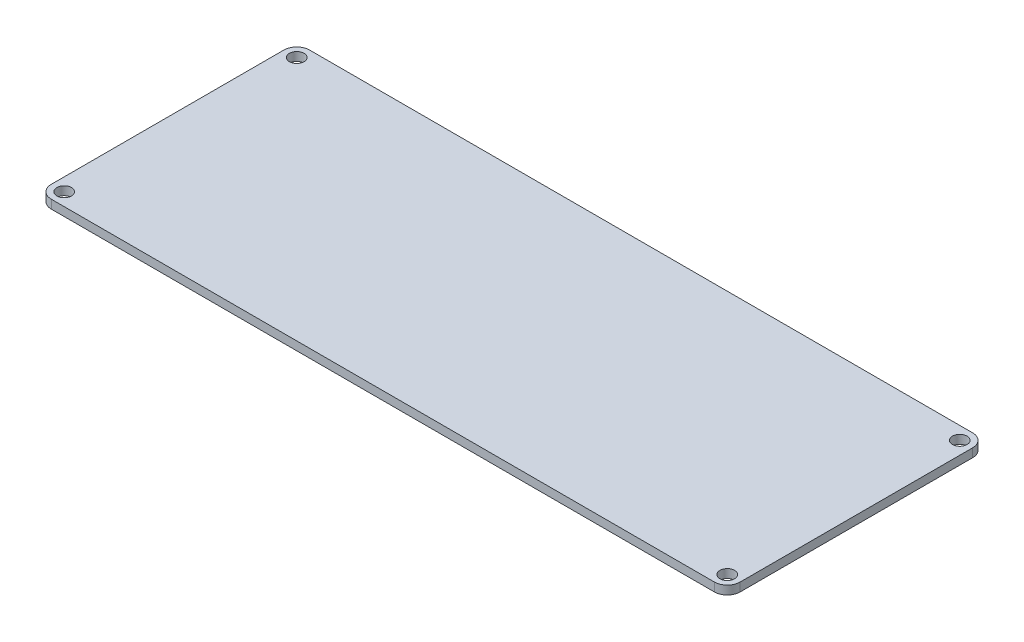
ISO-10303-21;
HEADER;
FILE_DESCRIPTION(('STEP AP214'),'2;1');
FILE_NAME('part.step','',(''),(''),'','','');
FILE_SCHEMA(('AUTOMOTIVE_DESIGN { 1 0 10303 214 1 1 1 1 }'));
ENDSEC;
DATA;
#1=APPLICATION_CONTEXT('core data for automotive mechanical design processes');
#2=APPLICATION_PROTOCOL_DEFINITION('international standard','automotive_design',2000,#1);
#3=PRODUCT_CONTEXT('',#1,'mechanical');
#4=PRODUCT('Part','Part','',(#3));
#5=PRODUCT_RELATED_PRODUCT_CATEGORY('part','',(#4));
#6=PRODUCT_DEFINITION_FORMATION('','',#4);
#7=PRODUCT_DEFINITION_CONTEXT('part definition',#1,'design');
#8=PRODUCT_DEFINITION('design','',#6,#7);
#9=PRODUCT_DEFINITION_SHAPE('','',#8);
#10=(LENGTH_UNIT() NAMED_UNIT(*) SI_UNIT(.MILLI.,.METRE.));
#11=(NAMED_UNIT(*) PLANE_ANGLE_UNIT() SI_UNIT($,.RADIAN.));
#12=(NAMED_UNIT(*) SI_UNIT($,.STERADIAN.) SOLID_ANGLE_UNIT());
#13=UNCERTAINTY_MEASURE_WITH_UNIT(LENGTH_MEASURE(1.E-05),#10,'distance_accuracy_value','');
#14=(GEOMETRIC_REPRESENTATION_CONTEXT(3) GLOBAL_UNCERTAINTY_ASSIGNED_CONTEXT((#13)) GLOBAL_UNIT_ASSIGNED_CONTEXT((#10,
#11,#12)) REPRESENTATION_CONTEXT('',''));
#15=CARTESIAN_POINT('',(0.,0.,0.));
#16=DIRECTION('',(0.,0.,1.));
#17=DIRECTION('',(1.,0.,0.));
#18=AXIS2_PLACEMENT_3D('',#15,#16,#17);
#19=CARTESIAN_POINT('',(80.,2.,30.));
#20=DIRECTION('',(-1.,0.,0.));
#21=DIRECTION('',(0.,0.,1.));
#22=AXIS2_PLACEMENT_3D('',#19,#20,#21);
#23=PLANE('',#22);
#24=DIRECTION('',(0.,0.,-1.));
#25=VECTOR('',#24,1.);
#26=CARTESIAN_POINT('',(80.,0.,30.));
#27=LINE('',#26,#25);
#28=CARTESIAN_POINT('',(80.,0.,27.));
#29=VERTEX_POINT('',#28);
#30=CARTESIAN_POINT('',(80.,0.,-27.));
#31=VERTEX_POINT('',#30);
#32=EDGE_CURVE('E127',#29,#31,#27,.T.);
#33=ORIENTED_EDGE('',*,*,#32,.T.);
#34=DIRECTION('',(0.,-1.,0.));
#35=VECTOR('',#34,1.);
#36=CARTESIAN_POINT('',(80.,2.,-27.));
#37=LINE('',#36,#35);
#38=CARTESIAN_POINT('',(80.,2.,-27.));
#39=VERTEX_POINT('',#38);
#40=EDGE_CURVE('E105',#31,#39,#37,.F.);
#41=ORIENTED_EDGE('',*,*,#40,.T.);
#42=DIRECTION('',(0.,0.,-1.));
#43=VECTOR('',#42,1.);
#44=CARTESIAN_POINT('',(80.,2.,30.));
#45=LINE('',#44,#43);
#46=CARTESIAN_POINT('',(80.,2.,27.));
#47=VERTEX_POINT('',#46);
#48=EDGE_CURVE('E137',#47,#39,#45,.T.);
#49=ORIENTED_EDGE('',*,*,#48,.F.);
#50=DIRECTION('',(0.,-1.,0.));
#51=VECTOR('',#50,1.);
#52=CARTESIAN_POINT('',(80.,2.,27.));
#53=LINE('',#52,#51);
#54=EDGE_CURVE('E110',#47,#29,#53,.T.);
#55=ORIENTED_EDGE('',*,*,#54,.T.);
#56=EDGE_LOOP('',(#33,#41,#49,#55));
#57=FACE_BOUND('',#56,.T.);
#58=ADVANCED_FACE('F33',(#57),#23,.F.);
#59=CARTESIAN_POINT('',(-80.,2.,-30.));
#60=DIRECTION('',(0.,0.,1.));
#61=DIRECTION('',(1.,0.,0.));
#62=AXIS2_PLACEMENT_3D('',#59,#60,#61);
#63=PLANE('',#62);
#64=DIRECTION('',(-1.,0.,0.));
#65=VECTOR('',#64,1.);
#66=CARTESIAN_POINT('',(-80.,2.,-30.));
#67=LINE('',#66,#65);
#68=CARTESIAN_POINT('',(77.,2.,-30.));
#69=VERTEX_POINT('',#68);
#70=CARTESIAN_POINT('',(-77.,2.,-30.));
#71=VERTEX_POINT('',#70);
#72=EDGE_CURVE('E120',#69,#71,#67,.T.);
#73=ORIENTED_EDGE('',*,*,#72,.F.);
#74=DIRECTION('',(0.,-1.,0.));
#75=VECTOR('',#74,1.);
#76=CARTESIAN_POINT('',(77.,2.,-30.));
#77=LINE('',#76,#75);
#78=CARTESIAN_POINT('',(77.,0.,-30.));
#79=VERTEX_POINT('',#78);
#80=EDGE_CURVE('E104',#69,#79,#77,.T.);
#81=ORIENTED_EDGE('',*,*,#80,.T.);
#82=DIRECTION('',(-1.,0.,0.));
#83=VECTOR('',#82,1.);
#84=CARTESIAN_POINT('',(-80.,0.,-30.));
#85=LINE('',#84,#83);
#86=CARTESIAN_POINT('',(-77.,0.,-30.));
#87=VERTEX_POINT('',#86);
#88=EDGE_CURVE('E117',#79,#87,#85,.T.);
#89=ORIENTED_EDGE('',*,*,#88,.T.);
#90=DIRECTION('',(0.,-1.,0.));
#91=VECTOR('',#90,1.);
#92=CARTESIAN_POINT('',(-77.,2.,-30.));
#93=LINE('',#92,#91);
#94=EDGE_CURVE('E122',#87,#71,#93,.F.);
#95=ORIENTED_EDGE('',*,*,#94,.T.);
#96=EDGE_LOOP('',(#73,#81,#89,#95));
#97=FACE_BOUND('',#96,.T.);
#98=ADVANCED_FACE('F116',(#97),#63,.F.);
#99=CARTESIAN_POINT('',(-80.,2.,30.));
#100=DIRECTION('',(1.,0.,0.));
#101=DIRECTION('',(0.,0.,-1.));
#102=AXIS2_PLACEMENT_3D('',#99,#100,#101);
#103=PLANE('',#102);
#104=DIRECTION('',(0.,0.,1.));
#105=VECTOR('',#104,1.);
#106=CARTESIAN_POINT('',(-80.,2.,30.));
#107=LINE('',#106,#105);
#108=CARTESIAN_POINT('',(-80.,2.,-27.));
#109=VERTEX_POINT('',#108);
#110=CARTESIAN_POINT('',(-80.,2.,27.));
#111=VERTEX_POINT('',#110);
#112=EDGE_CURVE('E187',#109,#111,#107,.T.);
#113=ORIENTED_EDGE('',*,*,#112,.F.);
#114=DIRECTION('',(0.,-1.,0.));
#115=VECTOR('',#114,1.);
#116=CARTESIAN_POINT('',(-80.,2.,-27.));
#117=LINE('',#116,#115);
#118=CARTESIAN_POINT('',(-80.,0.,-27.));
#119=VERTEX_POINT('',#118);
#120=EDGE_CURVE('E156',#109,#119,#117,.T.);
#121=ORIENTED_EDGE('',*,*,#120,.T.);
#122=DIRECTION('',(0.,0.,1.));
#123=VECTOR('',#122,1.);
#124=CARTESIAN_POINT('',(-80.,0.,30.));
#125=LINE('',#124,#123);
#126=CARTESIAN_POINT('',(-80.,0.,27.));
#127=VERTEX_POINT('',#126);
#128=EDGE_CURVE('E126',#119,#127,#125,.T.);
#129=ORIENTED_EDGE('',*,*,#128,.T.);
#130=DIRECTION('',(0.,-1.,0.));
#131=VECTOR('',#130,1.);
#132=CARTESIAN_POINT('',(-80.,2.,27.));
#133=LINE('',#132,#131);
#134=EDGE_CURVE('E154',#127,#111,#133,.F.);
#135=ORIENTED_EDGE('',*,*,#134,.T.);
#136=EDGE_LOOP('',(#113,#121,#129,#135));
#137=FACE_BOUND('',#136,.T.);
#138=ADVANCED_FACE('F202',(#137),#103,.F.);
#139=CARTESIAN_POINT('',(-80.,2.,30.));
#140=DIRECTION('',(0.,0.,-1.));
#141=DIRECTION('',(-1.,0.,0.));
#142=AXIS2_PLACEMENT_3D('',#139,#140,#141);
#143=PLANE('',#142);
#144=DIRECTION('',(1.,0.,0.));
#145=VECTOR('',#144,1.);
#146=CARTESIAN_POINT('',(-80.,0.,30.));
#147=LINE('',#146,#145);
#148=CARTESIAN_POINT('',(-77.,0.,30.));
#149=VERTEX_POINT('',#148);
#150=CARTESIAN_POINT('',(77.,0.,30.));
#151=VERTEX_POINT('',#150);
#152=EDGE_CURVE('E130',#149,#151,#147,.T.);
#153=ORIENTED_EDGE('',*,*,#152,.T.);
#154=DIRECTION('',(0.,-1.,0.));
#155=VECTOR('',#154,1.);
#156=CARTESIAN_POINT('',(77.,2.,30.));
#157=LINE('',#156,#155);
#158=CARTESIAN_POINT('',(77.,2.,30.));
#159=VERTEX_POINT('',#158);
#160=EDGE_CURVE('E11',#151,#159,#157,.F.);
#161=ORIENTED_EDGE('',*,*,#160,.T.);
#162=DIRECTION('',(1.,0.,0.));
#163=VECTOR('',#162,1.);
#164=CARTESIAN_POINT('',(-80.,2.,30.));
#165=LINE('',#164,#163);
#166=CARTESIAN_POINT('',(-77.,2.,30.));
#167=VERTEX_POINT('',#166);
#168=EDGE_CURVE('E138',#167,#159,#165,.T.);
#169=ORIENTED_EDGE('',*,*,#168,.F.);
#170=DIRECTION('',(0.,-1.,0.));
#171=VECTOR('',#170,1.);
#172=CARTESIAN_POINT('',(-77.,2.,30.));
#173=LINE('',#172,#171);
#174=EDGE_CURVE('E42',#167,#149,#173,.T.);
#175=ORIENTED_EDGE('',*,*,#174,.T.);
#176=EDGE_LOOP('',(#153,#161,#169,#175));
#177=FACE_BOUND('',#176,.T.);
#178=ADVANCED_FACE('F197',(#177),#143,.F.);
#179=CARTESIAN_POINT('',(0.,2.,0.));
#180=DIRECTION('',(0.,-1.,0.));
#181=DIRECTION('',(0.,0.,-1.));
#182=AXIS2_PLACEMENT_3D('',#179,#180,#181);
#183=PLANE('',#182);
#184=CARTESIAN_POINT('',(-77.,2.,-27.));
#185=DIRECTION('',(0.,1.,0.));
#186=DIRECTION('',(0.,0.,1.));
#187=AXIS2_PLACEMENT_3D('',#184,#185,#186);
#188=CIRCLE('',#187,1.69999999999999);
#189=CARTESIAN_POINT('',(-77.,2.,-25.3));
#190=VERTEX_POINT('',#189);
#191=EDGE_CURVE('E174',#190,#190,#188,.T.);
#192=ORIENTED_EDGE('',*,*,#191,.F.);
#193=EDGE_LOOP('',(#192));
#194=FACE_BOUND('',#193,.T.);
#195=CARTESIAN_POINT('',(-77.,2.,27.));
#196=DIRECTION('',(0.,1.,0.));
#197=DIRECTION('',(0.,0.,1.));
#198=AXIS2_PLACEMENT_3D('',#195,#196,#197);
#199=CIRCLE('',#198,1.69999999999999);
#200=CARTESIAN_POINT('',(-77.,2.,28.7));
#201=VERTEX_POINT('',#200);
#202=EDGE_CURVE('E163',#201,#201,#199,.T.);
#203=ORIENTED_EDGE('',*,*,#202,.F.);
#204=EDGE_LOOP('',(#203));
#205=FACE_BOUND('',#204,.T.);
#206=CARTESIAN_POINT('',(77.,2.,-27.));
#207=DIRECTION('',(0.,1.,0.));
#208=DIRECTION('',(0.,0.,1.));
#209=AXIS2_PLACEMENT_3D('',#206,#207,#208);
#210=CIRCLE('',#209,1.69999999999999);
#211=CARTESIAN_POINT('',(77.,2.,-25.3));
#212=VERTEX_POINT('',#211);
#213=EDGE_CURVE('E162',#212,#212,#210,.T.);
#214=ORIENTED_EDGE('',*,*,#213,.F.);
#215=EDGE_LOOP('',(#214));
#216=FACE_BOUND('',#215,.T.);
#217=CARTESIAN_POINT('',(77.,2.,27.));
#218=DIRECTION('',(0.,1.,0.));
#219=DIRECTION('',(0.,0.,1.));
#220=AXIS2_PLACEMENT_3D('',#217,#218,#219);
#221=CIRCLE('',#220,1.69999999999999);
#222=CARTESIAN_POINT('',(77.,2.,28.7));
#223=VERTEX_POINT('',#222);
#224=EDGE_CURVE('E179',#223,#223,#221,.T.);
#225=ORIENTED_EDGE('',*,*,#224,.F.);
#226=EDGE_LOOP('',(#225));
#227=FACE_BOUND('',#226,.T.);
#228=ORIENTED_EDGE('',*,*,#48,.T.);
#229=CARTESIAN_POINT('',(77.,2.,-27.));
#230=DIRECTION('',(0.,-1.,0.));
#231=DIRECTION('',(0.,0.,-1.));
#232=AXIS2_PLACEMENT_3D('',#229,#230,#231);
#233=CIRCLE('',#232,3.);
#234=EDGE_CURVE('E152',#39,#69,#233,.F.);
#235=ORIENTED_EDGE('',*,*,#234,.T.);
#236=ORIENTED_EDGE('',*,*,#72,.T.);
#237=CARTESIAN_POINT('',(-77.,2.,-27.));
#238=DIRECTION('',(0.,-1.,0.));
#239=DIRECTION('',(0.,0.,-1.));
#240=AXIS2_PLACEMENT_3D('',#237,#238,#239);
#241=CIRCLE('',#240,3.);
#242=EDGE_CURVE('E150',#71,#109,#241,.F.);
#243=ORIENTED_EDGE('',*,*,#242,.T.);
#244=ORIENTED_EDGE('',*,*,#112,.T.);
#245=CARTESIAN_POINT('',(-77.,2.,27.));
#246=DIRECTION('',(0.,-1.,0.));
#247=DIRECTION('',(0.,0.,-1.));
#248=AXIS2_PLACEMENT_3D('',#245,#246,#247);
#249=CIRCLE('',#248,3.);
#250=EDGE_CURVE('E55',#111,#167,#249,.F.);
#251=ORIENTED_EDGE('',*,*,#250,.T.);
#252=ORIENTED_EDGE('',*,*,#168,.T.);
#253=CARTESIAN_POINT('',(77.,2.,27.));
#254=DIRECTION('',(0.,-1.,0.));
#255=DIRECTION('',(0.,0.,-1.));
#256=AXIS2_PLACEMENT_3D('',#253,#254,#255);
#257=CIRCLE('',#256,3.);
#258=EDGE_CURVE('E148',#159,#47,#257,.F.);
#259=ORIENTED_EDGE('',*,*,#258,.T.);
#260=EDGE_LOOP('',(#228,#235,#236,#243,#244,#251,#252,#259));
#261=FACE_BOUND('',#260,.T.);
#262=ADVANCED_FACE('F189',(#194,#205,#216,#227,#261),#183,.F.);
#263=CARTESIAN_POINT('',(0.,0.,0.));
#264=DIRECTION('',(0.,-1.,0.));
#265=DIRECTION('',(0.,0.,-1.));
#266=AXIS2_PLACEMENT_3D('',#263,#264,#265);
#267=PLANE('',#266);
#268=CARTESIAN_POINT('',(-77.,0.,-27.));
#269=DIRECTION('',(0.,-1.,0.));
#270=DIRECTION('',(0.,0.,-1.));
#271=AXIS2_PLACEMENT_3D('',#268,#269,#270);
#272=CIRCLE('',#271,1.69999999999999);
#273=CARTESIAN_POINT('',(-77.,0.,-28.7));
#274=VERTEX_POINT('',#273);
#275=EDGE_CURVE('E37',#274,#274,#272,.T.);
#276=ORIENTED_EDGE('',*,*,#275,.F.);
#277=EDGE_LOOP('',(#276));
#278=FACE_BOUND('',#277,.T.);
#279=CARTESIAN_POINT('',(-77.,0.,27.));
#280=DIRECTION('',(0.,-1.,0.));
#281=DIRECTION('',(0.,0.,-1.));
#282=AXIS2_PLACEMENT_3D('',#279,#280,#281);
#283=CIRCLE('',#282,1.69999999999999);
#284=CARTESIAN_POINT('',(-77.,0.,25.3));
#285=VERTEX_POINT('',#284);
#286=EDGE_CURVE('E160',#285,#285,#283,.T.);
#287=ORIENTED_EDGE('',*,*,#286,.F.);
#288=EDGE_LOOP('',(#287));
#289=FACE_BOUND('',#288,.T.);
#290=CARTESIAN_POINT('',(77.,0.,-27.));
#291=DIRECTION('',(0.,-1.,0.));
#292=DIRECTION('',(0.,0.,-1.));
#293=AXIS2_PLACEMENT_3D('',#290,#291,#292);
#294=CIRCLE('',#293,1.69999999999999);
#295=CARTESIAN_POINT('',(77.,0.,-28.7));
#296=VERTEX_POINT('',#295);
#297=EDGE_CURVE('E167',#296,#296,#294,.T.);
#298=ORIENTED_EDGE('',*,*,#297,.F.);
#299=EDGE_LOOP('',(#298));
#300=FACE_BOUND('',#299,.T.);
#301=CARTESIAN_POINT('',(77.,0.,27.));
#302=DIRECTION('',(0.,-1.,0.));
#303=DIRECTION('',(0.,0.,-1.));
#304=AXIS2_PLACEMENT_3D('',#301,#302,#303);
#305=CIRCLE('',#304,1.69999999999999);
#306=CARTESIAN_POINT('',(77.,0.,25.3));
#307=VERTEX_POINT('',#306);
#308=EDGE_CURVE('E132',#307,#307,#305,.T.);
#309=ORIENTED_EDGE('',*,*,#308,.F.);
#310=EDGE_LOOP('',(#309));
#311=FACE_BOUND('',#310,.T.);
#312=ORIENTED_EDGE('',*,*,#88,.F.);
#313=CARTESIAN_POINT('',(77.,0.,-27.));
#314=DIRECTION('',(0.,-1.,0.));
#315=DIRECTION('',(0.,0.,-1.));
#316=AXIS2_PLACEMENT_3D('',#313,#314,#315);
#317=CIRCLE('',#316,3.);
#318=EDGE_CURVE('E100',#79,#31,#317,.T.);
#319=ORIENTED_EDGE('',*,*,#318,.T.);
#320=ORIENTED_EDGE('',*,*,#32,.F.);
#321=CARTESIAN_POINT('',(77.,0.,27.));
#322=DIRECTION('',(0.,-1.,0.));
#323=DIRECTION('',(0.,0.,-1.));
#324=AXIS2_PLACEMENT_3D('',#321,#322,#323);
#325=CIRCLE('',#324,3.);
#326=EDGE_CURVE('E141',#29,#151,#325,.T.);
#327=ORIENTED_EDGE('',*,*,#326,.T.);
#328=ORIENTED_EDGE('',*,*,#152,.F.);
#329=CARTESIAN_POINT('',(-77.,0.,27.));
#330=DIRECTION('',(0.,-1.,0.));
#331=DIRECTION('',(0.,0.,-1.));
#332=AXIS2_PLACEMENT_3D('',#329,#330,#331);
#333=CIRCLE('',#332,3.);
#334=EDGE_CURVE('E121',#149,#127,#333,.T.);
#335=ORIENTED_EDGE('',*,*,#334,.T.);
#336=ORIENTED_EDGE('',*,*,#128,.F.);
#337=CARTESIAN_POINT('',(-77.,0.,-27.));
#338=DIRECTION('',(0.,-1.,0.));
#339=DIRECTION('',(0.,0.,-1.));
#340=AXIS2_PLACEMENT_3D('',#337,#338,#339);
#341=CIRCLE('',#340,3.);
#342=EDGE_CURVE('E111',#119,#87,#341,.T.);
#343=ORIENTED_EDGE('',*,*,#342,.T.);
#344=EDGE_LOOP('',(#312,#319,#320,#327,#328,#335,#336,#343));
#345=FACE_BOUND('',#344,.T.);
#346=ADVANCED_FACE('F124',(#278,#289,#300,#311,#345),#267,.T.);
#347=CARTESIAN_POINT('',(77.,2.,-27.));
#348=DIRECTION('',(0.,-1.,0.));
#349=DIRECTION('',(0.,0.,-1.));
#350=AXIS2_PLACEMENT_3D('',#347,#348,#349);
#351=CYLINDRICAL_SURFACE('',#350,3.);
#352=ORIENTED_EDGE('',*,*,#234,.F.);
#353=ORIENTED_EDGE('',*,*,#40,.F.);
#354=ORIENTED_EDGE('',*,*,#318,.F.);
#355=ORIENTED_EDGE('',*,*,#80,.F.);
#356=EDGE_LOOP('',(#352,#353,#354,#355));
#357=FACE_BOUND('',#356,.T.);
#358=ADVANCED_FACE('F103',(#357),#351,.T.);
#359=CARTESIAN_POINT('',(-77.,2.,-27.));
#360=DIRECTION('',(0.,-1.,0.));
#361=DIRECTION('',(0.,0.,-1.));
#362=AXIS2_PLACEMENT_3D('',#359,#360,#361);
#363=CYLINDRICAL_SURFACE('',#362,3.);
#364=ORIENTED_EDGE('',*,*,#242,.F.);
#365=ORIENTED_EDGE('',*,*,#94,.F.);
#366=ORIENTED_EDGE('',*,*,#342,.F.);
#367=ORIENTED_EDGE('',*,*,#120,.F.);
#368=EDGE_LOOP('',(#364,#365,#366,#367));
#369=FACE_BOUND('',#368,.T.);
#370=ADVANCED_FACE('F206',(#369),#363,.T.);
#371=CARTESIAN_POINT('',(77.,2.,27.));
#372=DIRECTION('',(0.,-1.,0.));
#373=DIRECTION('',(0.,0.,-1.));
#374=AXIS2_PLACEMENT_3D('',#371,#372,#373);
#375=CYLINDRICAL_SURFACE('',#374,3.);
#376=ORIENTED_EDGE('',*,*,#258,.F.);
#377=ORIENTED_EDGE('',*,*,#160,.F.);
#378=ORIENTED_EDGE('',*,*,#326,.F.);
#379=ORIENTED_EDGE('',*,*,#54,.F.);
#380=EDGE_LOOP('',(#376,#377,#378,#379));
#381=FACE_BOUND('',#380,.T.);
#382=ADVANCED_FACE('F194',(#381),#375,.T.);
#383=CARTESIAN_POINT('',(-77.,2.,27.));
#384=DIRECTION('',(0.,-1.,0.));
#385=DIRECTION('',(0.,0.,-1.));
#386=AXIS2_PLACEMENT_3D('',#383,#384,#385);
#387=CYLINDRICAL_SURFACE('',#386,3.);
#388=ORIENTED_EDGE('',*,*,#250,.F.);
#389=ORIENTED_EDGE('',*,*,#134,.F.);
#390=ORIENTED_EDGE('',*,*,#334,.F.);
#391=ORIENTED_EDGE('',*,*,#174,.F.);
#392=EDGE_LOOP('',(#388,#389,#390,#391));
#393=FACE_BOUND('',#392,.T.);
#394=ADVANCED_FACE('F35',(#393),#387,.T.);
#395=CARTESIAN_POINT('',(77.,2.,27.));
#396=DIRECTION('',(0.,1.,0.));
#397=DIRECTION('',(0.,0.,1.));
#398=AXIS2_PLACEMENT_3D('',#395,#396,#397);
#399=CYLINDRICAL_SURFACE('',#398,1.69999999999999);
#400=ORIENTED_EDGE('',*,*,#308,.T.);
#401=EDGE_LOOP('',(#400));
#402=FACE_BOUND('',#401,.T.);
#403=ORIENTED_EDGE('',*,*,#224,.T.);
#404=EDGE_LOOP('',(#403));
#405=FACE_BOUND('',#404,.T.);
#406=ADVANCED_FACE('F231',(#402,#405),#399,.F.);
#407=CARTESIAN_POINT('',(77.,2.,-27.));
#408=DIRECTION('',(0.,1.,0.));
#409=DIRECTION('',(0.,0.,1.));
#410=AXIS2_PLACEMENT_3D('',#407,#408,#409);
#411=CYLINDRICAL_SURFACE('',#410,1.69999999999999);
#412=ORIENTED_EDGE('',*,*,#297,.T.);
#413=EDGE_LOOP('',(#412));
#414=FACE_BOUND('',#413,.T.);
#415=ORIENTED_EDGE('',*,*,#213,.T.);
#416=EDGE_LOOP('',(#415));
#417=FACE_BOUND('',#416,.T.);
#418=ADVANCED_FACE('F234',(#414,#417),#411,.F.);
#419=CARTESIAN_POINT('',(-77.,2.,27.));
#420=DIRECTION('',(0.,1.,0.));
#421=DIRECTION('',(0.,0.,1.));
#422=AXIS2_PLACEMENT_3D('',#419,#420,#421);
#423=CYLINDRICAL_SURFACE('',#422,1.69999999999999);
#424=ORIENTED_EDGE('',*,*,#286,.T.);
#425=EDGE_LOOP('',(#424));
#426=FACE_BOUND('',#425,.T.);
#427=ORIENTED_EDGE('',*,*,#202,.T.);
#428=EDGE_LOOP('',(#427));
#429=FACE_BOUND('',#428,.T.);
#430=ADVANCED_FACE('F238',(#426,#429),#423,.F.);
#431=CARTESIAN_POINT('',(-77.,2.,-27.));
#432=DIRECTION('',(0.,1.,0.));
#433=DIRECTION('',(0.,0.,1.));
#434=AXIS2_PLACEMENT_3D('',#431,#432,#433);
#435=CYLINDRICAL_SURFACE('',#434,1.69999999999999);
#436=ORIENTED_EDGE('',*,*,#275,.T.);
#437=EDGE_LOOP('',(#436));
#438=FACE_BOUND('',#437,.T.);
#439=ORIENTED_EDGE('',*,*,#191,.T.);
#440=EDGE_LOOP('',(#439));
#441=FACE_BOUND('',#440,.T.);
#442=ADVANCED_FACE('F242',(#438,#441),#435,.F.);
#443=CLOSED_SHELL('',(#58,#98,#138,#178,#262,#346,#358,#370,#382,#394,#406,#418,#430,#442));
#444=MANIFOLD_SOLID_BREP('B2',#443);
#445=ADVANCED_BREP_SHAPE_REPRESENTATION('',(#18,#444),#14);
#446=SHAPE_DEFINITION_REPRESENTATION(#9,#445);
ENDSEC;
END-ISO-10303-21;
